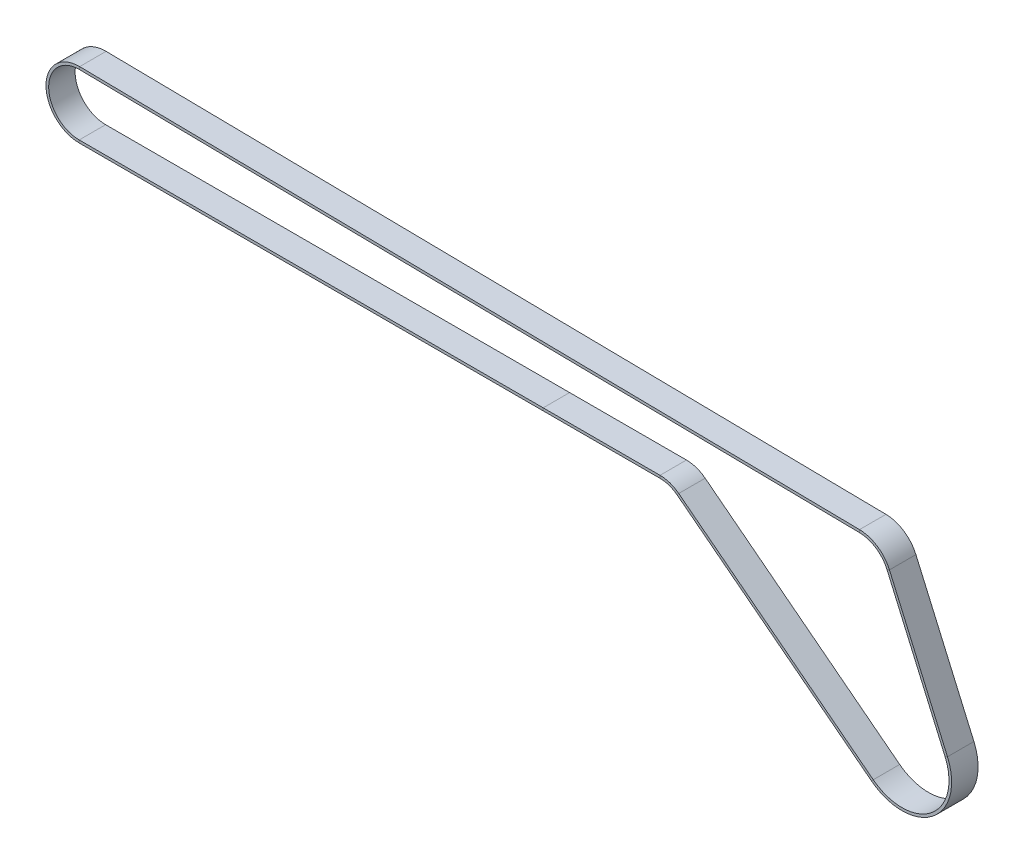
ISO-10303-21;
HEADER;
FILE_DESCRIPTION(('STEP AP214'),'2;1');
FILE_NAME('part.step','',(''),(''),'','','');
FILE_SCHEMA(('AUTOMOTIVE_DESIGN { 1 0 10303 214 1 1 1 1 }'));
ENDSEC;
DATA;
#1=APPLICATION_CONTEXT('core data for automotive mechanical design processes');
#2=APPLICATION_PROTOCOL_DEFINITION('international standard','automotive_design',2000,#1);
#3=PRODUCT_CONTEXT('',#1,'mechanical');
#4=PRODUCT('Part','Part','',(#3));
#5=PRODUCT_RELATED_PRODUCT_CATEGORY('part','',(#4));
#6=PRODUCT_DEFINITION_FORMATION('','',#4);
#7=PRODUCT_DEFINITION_CONTEXT('part definition',#1,'design');
#8=PRODUCT_DEFINITION('design','',#6,#7);
#9=PRODUCT_DEFINITION_SHAPE('','',#8);
#10=(LENGTH_UNIT() NAMED_UNIT(*) SI_UNIT(.MILLI.,.METRE.));
#11=(NAMED_UNIT(*) PLANE_ANGLE_UNIT() SI_UNIT($,.RADIAN.));
#12=(NAMED_UNIT(*) SI_UNIT($,.STERADIAN.) SOLID_ANGLE_UNIT());
#13=UNCERTAINTY_MEASURE_WITH_UNIT(LENGTH_MEASURE(1.E-05),#10,'distance_accuracy_value','');
#14=(GEOMETRIC_REPRESENTATION_CONTEXT(3) GLOBAL_UNCERTAINTY_ASSIGNED_CONTEXT((#13)) GLOBAL_UNIT_ASSIGNED_CONTEXT((#10,
#11,#12)) REPRESENTATION_CONTEXT('',''));
#15=CARTESIAN_POINT('',(0.,0.,0.));
#16=DIRECTION('',(0.,0.,1.));
#17=DIRECTION('',(1.,0.,0.));
#18=AXIS2_PLACEMENT_3D('',#15,#16,#17);
#19=CARTESIAN_POINT('',(44.1923018206319,0.,5.));
#20=DIRECTION('',(0.,0.,-1.));
#21=DIRECTION('',(-1.,0.,0.));
#22=AXIS2_PLACEMENT_3D('',#19,#20,#21);
#23=PLANE('',#22);
#24=DIRECTION('',(0.,-1.,0.));
#25=VECTOR('',#24,1.);
#26=CARTESIAN_POINT('',(44.1923018206319,0.,5.));
#27=LINE('',#26,#25);
#28=CARTESIAN_POINT('',(44.1923018206319,0.,5.));
#29=VERTEX_POINT('',#28);
#30=CARTESIAN_POINT('',(44.1923018206319,-0.999999999999999,5.));
#31=VERTEX_POINT('',#30);
#32=EDGE_CURVE('E215',#29,#31,#27,.T.);
#33=ORIENTED_EDGE('',*,*,#32,.F.);
#34=DIRECTION('',(-1.,0.,0.));
#35=VECTOR('',#34,1.);
#36=CARTESIAN_POINT('',(44.1923018206319,0.,5.));
#37=LINE('',#36,#35);
#38=CARTESIAN_POINT('',(0.,0.,5.));
#39=VERTEX_POINT('',#38);
#40=EDGE_CURVE('E214',#29,#39,#37,.T.);
#41=ORIENTED_EDGE('',*,*,#40,.T.);
#42=DIRECTION('',(0.,-1.,0.));
#43=VECTOR('',#42,1.);
#44=CARTESIAN_POINT('',(0.,0.,5.));
#45=LINE('',#44,#43);
#46=CARTESIAN_POINT('',(0.,-1.,5.));
#47=VERTEX_POINT('',#46);
#48=EDGE_CURVE('E189',#39,#47,#45,.T.);
#49=ORIENTED_EDGE('',*,*,#48,.T.);
#50=DIRECTION('',(-1.,0.,0.));
#51=VECTOR('',#50,1.);
#52=CARTESIAN_POINT('',(44.1923018206319,-0.999999999999994,5.));
#53=LINE('',#52,#51);
#54=EDGE_CURVE('E219',#31,#47,#53,.T.);
#55=ORIENTED_EDGE('',*,*,#54,.F.);
#56=EDGE_LOOP('',(#33,#41,#49,#55));
#57=FACE_BOUND('',#56,.T.);
#58=ADVANCED_FACE('F33',(#57),#23,.F.);
#59=CARTESIAN_POINT('',(0.,0.,5.));
#60=DIRECTION('',(0.,0.,-1.));
#61=DIRECTION('',(-1.,0.,0.));
#62=AXIS2_PLACEMENT_3D('',#59,#60,#61);
#63=PLANE('',#62);
#64=DIRECTION('',(-1.,0.,0.));
#65=VECTOR('',#64,1.);
#66=CARTESIAN_POINT('',(0.,-1.,5.));
#67=LINE('',#66,#65);
#68=CARTESIAN_POINT('',(-175.502777550755,-1.00000000000002,5.));
#69=VERTEX_POINT('',#68);
#70=EDGE_CURVE('E195',#47,#69,#67,.T.);
#71=ORIENTED_EDGE('',*,*,#70,.F.);
#72=ORIENTED_EDGE('',*,*,#48,.F.);
#73=DIRECTION('',(-1.,0.,0.));
#74=VECTOR('',#73,1.);
#75=CARTESIAN_POINT('',(0.,0.,5.));
#76=LINE('',#75,#74);
#77=CARTESIAN_POINT('',(-175.502777550755,0.,5.));
#78=VERTEX_POINT('',#77);
#79=EDGE_CURVE('E193',#39,#78,#76,.T.);
#80=ORIENTED_EDGE('',*,*,#79,.T.);
#81=DIRECTION('',(0.,-1.,0.));
#82=VECTOR('',#81,1.);
#83=CARTESIAN_POINT('',(-175.502777550755,0.,5.));
#84=LINE('',#83,#82);
#85=EDGE_CURVE('E211',#78,#69,#84,.T.);
#86=ORIENTED_EDGE('',*,*,#85,.T.);
#87=EDGE_LOOP('',(#71,#72,#80,#86));
#88=FACE_BOUND('',#87,.T.);
#89=ADVANCED_FACE('F191',(#88),#63,.F.);
#90=CARTESIAN_POINT('',(0.,-1.,5.));
#91=DIRECTION('',(0.,1.,0.));
#92=DIRECTION('',(0.,0.,1.));
#93=AXIS2_PLACEMENT_3D('',#90,#91,#92);
#94=PLANE('',#93);
#95=DIRECTION('',(-1.,0.,0.));
#96=VECTOR('',#95,1.);
#97=CARTESIAN_POINT('',(0.,-0.999999999999998,-5.));
#98=LINE('',#97,#96);
#99=CARTESIAN_POINT('',(0.,-0.999999999999998,-5.));
#100=VERTEX_POINT('',#99);
#101=CARTESIAN_POINT('',(-175.502777550755,-1.00000000000002,-5.));
#102=VERTEX_POINT('',#101);
#103=EDGE_CURVE('E276',#100,#102,#98,.T.);
#104=ORIENTED_EDGE('',*,*,#103,.F.);
#105=DIRECTION('',(0.,0.,-1.));
#106=VECTOR('',#105,1.);
#107=CARTESIAN_POINT('',(0.,-1.,5.));
#108=LINE('',#107,#106);
#109=EDGE_CURVE('E200',#47,#100,#108,.T.);
#110=ORIENTED_EDGE('',*,*,#109,.F.);
#111=ORIENTED_EDGE('',*,*,#70,.T.);
#112=DIRECTION('',(0.,0.,-1.));
#113=VECTOR('',#112,1.);
#114=CARTESIAN_POINT('',(-175.502777550755,-1.00000000000002,5.));
#115=LINE('',#114,#113);
#116=EDGE_CURVE('E332',#69,#102,#115,.T.);
#117=ORIENTED_EDGE('',*,*,#116,.T.);
#118=EDGE_LOOP('',(#104,#110,#111,#117));
#119=FACE_BOUND('',#118,.T.);
#120=ADVANCED_FACE('F370',(#119),#94,.F.);
#121=CARTESIAN_POINT('',(0.,0.,-5.));
#122=DIRECTION('',(0.,0.,1.));
#123=DIRECTION('',(1.,0.,0.));
#124=AXIS2_PLACEMENT_3D('',#121,#122,#123);
#125=PLANE('',#124);
#126=DIRECTION('',(-1.,0.,0.));
#127=VECTOR('',#126,1.);
#128=CARTESIAN_POINT('',(0.,0.,-5.));
#129=LINE('',#128,#127);
#130=CARTESIAN_POINT('',(0.,0.,-5.));
#131=VERTEX_POINT('',#130);
#132=CARTESIAN_POINT('',(-175.502777550755,0.,-5.));
#133=VERTEX_POINT('',#132);
#134=EDGE_CURVE('E230',#131,#133,#129,.T.);
#135=ORIENTED_EDGE('',*,*,#134,.F.);
#136=DIRECTION('',(0.,1.,0.));
#137=VECTOR('',#136,1.);
#138=CARTESIAN_POINT('',(0.,0.,-5.));
#139=LINE('',#138,#137);
#140=EDGE_CURVE('E222',#100,#131,#139,.T.);
#141=ORIENTED_EDGE('',*,*,#140,.F.);
#142=ORIENTED_EDGE('',*,*,#103,.T.);
#143=DIRECTION('',(0.,1.,0.));
#144=VECTOR('',#143,1.);
#145=CARTESIAN_POINT('',(-175.502777550755,0.,-5.));
#146=LINE('',#145,#144);
#147=EDGE_CURVE('E279',#102,#133,#146,.T.);
#148=ORIENTED_EDGE('',*,*,#147,.T.);
#149=EDGE_LOOP('',(#135,#141,#142,#148));
#150=FACE_BOUND('',#149,.T.);
#151=ADVANCED_FACE('F274',(#150),#125,.F.);
#152=CARTESIAN_POINT('',(0.,0.,5.));
#153=DIRECTION('',(0.,-1.,0.));
#154=DIRECTION('',(1.,0.,0.));
#155=AXIS2_PLACEMENT_3D('',#152,#153,#154);
#156=PLANE('',#155);
#157=DIRECTION('',(0.,0.,1.));
#158=VECTOR('',#157,1.);
#159=CARTESIAN_POINT('',(-175.502777550755,0.,5.));
#160=LINE('',#159,#158);
#161=EDGE_CURVE('E209',#133,#78,#160,.T.);
#162=ORIENTED_EDGE('',*,*,#161,.T.);
#163=ORIENTED_EDGE('',*,*,#79,.F.);
#164=DIRECTION('',(0.,0.,1.));
#165=VECTOR('',#164,1.);
#166=CARTESIAN_POINT('',(0.,0.,5.));
#167=LINE('',#166,#165);
#168=EDGE_CURVE('E207',#131,#39,#167,.T.);
#169=ORIENTED_EDGE('',*,*,#168,.F.);
#170=ORIENTED_EDGE('',*,*,#134,.T.);
#171=EDGE_LOOP('',(#162,#163,#169,#170));
#172=FACE_BOUND('',#171,.T.);
#173=ADVANCED_FACE('F205',(#172),#156,.F.);
#174=CARTESIAN_POINT('',(-175.502777550755,0.,5.));
#175=DIRECTION('',(0.,0.,-1.));
#176=DIRECTION('',(-1.,0.,0.));
#177=AXIS2_PLACEMENT_3D('',#174,#175,#176);
#178=PLANE('',#177);
#179=CARTESIAN_POINT('',(-175.502777550755,11.555,5.));
#180=DIRECTION('',(0.,0.,-1.));
#181=DIRECTION('',(0.,-1.,0.));
#182=AXIS2_PLACEMENT_3D('',#179,#180,#181);
#183=CIRCLE('',#182,12.555);
#184=CARTESIAN_POINT('',(-175.32518130957,24.1087438469612,5.));
#185=VERTEX_POINT('',#184);
#186=EDGE_CURVE('E338',#69,#185,#183,.T.);
#187=ORIENTED_EDGE('',*,*,#186,.F.);
#188=ORIENTED_EDGE('',*,*,#85,.F.);
#189=CARTESIAN_POINT('',(-175.502777550755,11.555,5.));
#190=DIRECTION('',(0.,0.,-1.));
#191=DIRECTION('',(0.,-1.,0.));
#192=AXIS2_PLACEMENT_3D('',#189,#190,#191);
#193=CIRCLE('',#192,11.555);
#194=CARTESIAN_POINT('',(-175.339326768844,23.1088438989755,5.));
#195=VERTEX_POINT('',#194);
#196=EDGE_CURVE('E229',#78,#195,#193,.T.);
#197=ORIENTED_EDGE('',*,*,#196,.T.);
#198=DIRECTION('',(0.0141454592740196,0.999899947985761,0.));
#199=VECTOR('',#198,1.);
#200=CARTESIAN_POINT('',(-175.339326768844,23.1088438989755,5.));
#201=LINE('',#200,#199);
#202=EDGE_CURVE('E388',#195,#185,#201,.T.);
#203=ORIENTED_EDGE('',*,*,#202,.T.);
#204=EDGE_LOOP('',(#187,#188,#197,#203));
#205=FACE_BOUND('',#204,.T.);
#206=ADVANCED_FACE('F458',(#205),#178,.F.);
#207=CARTESIAN_POINT('',(-175.502777550755,11.555,0.));
#208=DIRECTION('',(0.,0.,-1.));
#209=DIRECTION('',(-1.,0.,0.));
#210=AXIS2_PLACEMENT_3D('',#207,#208,#209);
#211=CYLINDRICAL_SURFACE('',#210,12.555);
#212=CARTESIAN_POINT('',(-175.502777550755,11.555,-5.));
#213=DIRECTION('',(0.,0.,-1.));
#214=DIRECTION('',(0.,-1.,0.));
#215=AXIS2_PLACEMENT_3D('',#212,#213,#214);
#216=CIRCLE('',#215,12.555);
#217=CARTESIAN_POINT('',(-175.32518130957,24.1087438469612,-5.));
#218=VERTEX_POINT('',#217);
#219=EDGE_CURVE('E287',#102,#218,#216,.T.);
#220=ORIENTED_EDGE('',*,*,#219,.F.);
#221=ORIENTED_EDGE('',*,*,#116,.F.);
#222=ORIENTED_EDGE('',*,*,#186,.T.);
#223=DIRECTION('',(0.,0.,-1.));
#224=VECTOR('',#223,1.);
#225=CARTESIAN_POINT('',(-175.32518130957,24.1087438469612,5.));
#226=LINE('',#225,#224);
#227=EDGE_CURVE('E335',#185,#218,#226,.T.);
#228=ORIENTED_EDGE('',*,*,#227,.T.);
#229=EDGE_LOOP('',(#220,#221,#222,#228));
#230=FACE_BOUND('',#229,.T.);
#231=ADVANCED_FACE('F374',(#230),#211,.T.);
#232=CARTESIAN_POINT('',(-175.502777550755,0.,-5.));
#233=DIRECTION('',(0.,0.,1.));
#234=DIRECTION('',(1.,0.,0.));
#235=AXIS2_PLACEMENT_3D('',#232,#233,#234);
#236=PLANE('',#235);
#237=CARTESIAN_POINT('',(-175.502777550755,11.555,-5.));
#238=DIRECTION('',(0.,0.,-1.));
#239=DIRECTION('',(0.,-1.,0.));
#240=AXIS2_PLACEMENT_3D('',#237,#238,#239);
#241=CIRCLE('',#240,11.555);
#242=CARTESIAN_POINT('',(-175.339326768844,23.1088438989755,-5.));
#243=VERTEX_POINT('',#242);
#244=EDGE_CURVE('E235',#133,#243,#241,.T.);
#245=ORIENTED_EDGE('',*,*,#244,.F.);
#246=ORIENTED_EDGE('',*,*,#147,.F.);
#247=ORIENTED_EDGE('',*,*,#219,.T.);
#248=DIRECTION('',(-0.0141454592740196,-0.999899947985761,0.));
#249=VECTOR('',#248,1.);
#250=CARTESIAN_POINT('',(-175.339326768844,23.1088438989755,-5.));
#251=LINE('',#250,#249);
#252=EDGE_CURVE('E284',#218,#243,#251,.T.);
#253=ORIENTED_EDGE('',*,*,#252,.T.);
#254=EDGE_LOOP('',(#245,#246,#247,#253));
#255=FACE_BOUND('',#254,.T.);
#256=ADVANCED_FACE('F378',(#255),#236,.F.);
#257=CARTESIAN_POINT('',(-175.502777550755,11.555,0.));
#258=DIRECTION('',(0.,0.,-1.));
#259=DIRECTION('',(-1.,0.,0.));
#260=AXIS2_PLACEMENT_3D('',#257,#258,#259);
#261=CYLINDRICAL_SURFACE('',#260,11.555);
#262=DIRECTION('',(0.,0.,1.));
#263=VECTOR('',#262,1.);
#264=CARTESIAN_POINT('',(-175.339326768844,23.1088438989755,5.));
#265=LINE('',#264,#263);
#266=EDGE_CURVE('E231',#243,#195,#265,.T.);
#267=ORIENTED_EDGE('',*,*,#266,.T.);
#268=ORIENTED_EDGE('',*,*,#196,.F.);
#269=ORIENTED_EDGE('',*,*,#161,.F.);
#270=ORIENTED_EDGE('',*,*,#244,.T.);
#271=EDGE_LOOP('',(#267,#268,#269,#270));
#272=FACE_BOUND('',#271,.T.);
#273=ADVANCED_FACE('F382',(#272),#261,.F.);
#274=CARTESIAN_POINT('',(-175.339326768844,23.1088438989755,5.));
#275=DIRECTION('',(0.,0.,-1.));
#276=DIRECTION('',(-1.,0.,0.));
#277=AXIS2_PLACEMENT_3D('',#274,#275,#276);
#278=PLANE('',#277);
#279=DIRECTION('',(0.999899947985761,-0.014145459274014,0.));
#280=VECTOR('',#279,1.);
#281=CARTESIAN_POINT('',(-175.32518130957,24.1087438469612,5.));
#282=LINE('',#281,#280);
#283=CARTESIAN_POINT('',(119.64530334623,19.9358333611271,5.));
#284=VERTEX_POINT('',#283);
#285=EDGE_CURVE('E343',#185,#284,#282,.T.);
#286=ORIENTED_EDGE('',*,*,#285,.F.);
#287=ORIENTED_EDGE('',*,*,#202,.F.);
#288=DIRECTION('',(0.999899947985761,-0.014145459274014,0.));
#289=VECTOR('',#288,1.);
#290=CARTESIAN_POINT('',(-175.339326768844,23.1088438989755,5.));
#291=LINE('',#290,#289);
#292=CARTESIAN_POINT('',(119.631157886956,18.9359334131414,5.));
#293=VERTEX_POINT('',#292);
#294=EDGE_CURVE('E234',#195,#293,#291,.T.);
#295=ORIENTED_EDGE('',*,*,#294,.T.);
#296=DIRECTION('',(0.0141454592740141,0.999899947985761,0.));
#297=VECTOR('',#296,1.);
#298=CARTESIAN_POINT('',(119.631157886956,18.9359334131414,5.));
#299=LINE('',#298,#297);
#300=EDGE_CURVE('E294',#293,#284,#299,.T.);
#301=ORIENTED_EDGE('',*,*,#300,.T.);
#302=EDGE_LOOP('',(#286,#287,#295,#301));
#303=FACE_BOUND('',#302,.T.);
#304=ADVANCED_FACE('F456',(#303),#278,.F.);
#305=CARTESIAN_POINT('',(-175.32518130957,24.1087438469612,5.));
#306=DIRECTION('',(-0.014145459274014,-0.999899947985761,0.));
#307=DIRECTION('',(0.999899947985761,-0.014145459274014,0.));
#308=AXIS2_PLACEMENT_3D('',#305,#306,#307);
#309=PLANE('',#308);
#310=DIRECTION('',(0.999899947985761,-0.014145459274014,0.));
#311=VECTOR('',#310,1.);
#312=CARTESIAN_POINT('',(-175.32518130957,24.1087438469612,-5.));
#313=LINE('',#312,#311);
#314=CARTESIAN_POINT('',(119.64530334623,19.9358333611271,-5.));
#315=VERTEX_POINT('',#314);
#316=EDGE_CURVE('E295',#218,#315,#313,.T.);
#317=ORIENTED_EDGE('',*,*,#316,.F.);
#318=ORIENTED_EDGE('',*,*,#227,.F.);
#319=ORIENTED_EDGE('',*,*,#285,.T.);
#320=DIRECTION('',(0.,0.,-1.));
#321=VECTOR('',#320,1.);
#322=CARTESIAN_POINT('',(119.64530334623,19.9358333611271,5.));
#323=LINE('',#322,#321);
#324=EDGE_CURVE('E291',#284,#315,#323,.T.);
#325=ORIENTED_EDGE('',*,*,#324,.T.);
#326=EDGE_LOOP('',(#317,#318,#319,#325));
#327=FACE_BOUND('',#326,.T.);
#328=ADVANCED_FACE('F455',(#327),#309,.F.);
#329=CARTESIAN_POINT('',(-175.339326768844,23.1088438989755,-5.));
#330=DIRECTION('',(0.,0.,1.));
#331=DIRECTION('',(1.,0.,0.));
#332=AXIS2_PLACEMENT_3D('',#329,#330,#331);
#333=PLANE('',#332);
#334=DIRECTION('',(0.999899947985761,-0.014145459274014,0.));
#335=VECTOR('',#334,1.);
#336=CARTESIAN_POINT('',(-175.339326768844,23.1088438989755,-5.));
#337=LINE('',#336,#335);
#338=CARTESIAN_POINT('',(119.631157886956,18.9359334131414,-5.));
#339=VERTEX_POINT('',#338);
#340=EDGE_CURVE('E292',#243,#339,#337,.T.);
#341=ORIENTED_EDGE('',*,*,#340,.F.);
#342=ORIENTED_EDGE('',*,*,#252,.F.);
#343=ORIENTED_EDGE('',*,*,#316,.T.);
#344=DIRECTION('',(-0.0141454592740141,-0.999899947985761,0.));
#345=VECTOR('',#344,1.);
#346=CARTESIAN_POINT('',(119.631157886956,18.9359334131414,-5.));
#347=LINE('',#346,#345);
#348=EDGE_CURVE('E240',#315,#339,#347,.T.);
#349=ORIENTED_EDGE('',*,*,#348,.T.);
#350=EDGE_LOOP('',(#341,#342,#343,#349));
#351=FACE_BOUND('',#350,.T.);
#352=ADVANCED_FACE('F453',(#351),#333,.F.);
#353=CARTESIAN_POINT('',(-175.339326768844,23.1088438989755,5.));
#354=DIRECTION('',(0.014145459274014,0.999899947985761,0.));
#355=DIRECTION('',(-0.999899947985761,0.014145459274014,0.));
#356=AXIS2_PLACEMENT_3D('',#353,#354,#355);
#357=PLANE('',#356);
#358=DIRECTION('',(0.,0.,1.));
#359=VECTOR('',#358,1.);
#360=CARTESIAN_POINT('',(119.631157886956,18.9359334131414,5.));
#361=LINE('',#360,#359);
#362=EDGE_CURVE('E236',#339,#293,#361,.T.);
#363=ORIENTED_EDGE('',*,*,#362,.T.);
#364=ORIENTED_EDGE('',*,*,#294,.F.);
#365=ORIENTED_EDGE('',*,*,#266,.F.);
#366=ORIENTED_EDGE('',*,*,#340,.T.);
#367=EDGE_LOOP('',(#363,#364,#365,#366));
#368=FACE_BOUND('',#367,.T.);
#369=ADVANCED_FACE('F451',(#368),#357,.F.);
#370=CARTESIAN_POINT('',(119.631157886956,18.9359334131414,5.));
#371=DIRECTION('',(0.,0.,-1.));
#372=DIRECTION('',(-1.,0.,0.));
#373=AXIS2_PLACEMENT_3D('',#370,#371,#372);
#374=PLANE('',#373);
#375=CARTESIAN_POINT('',(119.467707105045,7.38208951416586,5.));
#376=DIRECTION('',(0.,0.,-1.));
#377=DIRECTION('',(0.0141454592740025,0.999899947985761,0.));
#378=AXIS2_PLACEMENT_3D('',#375,#376,#377);
#379=CIRCLE('',#378,12.555);
#380=CARTESIAN_POINT('',(130.973228782012,12.4071264235667,5.));
#381=VERTEX_POINT('',#380);
#382=EDGE_CURVE('E347',#284,#381,#379,.T.);
#383=ORIENTED_EDGE('',*,*,#382,.F.);
#384=ORIENTED_EDGE('',*,*,#300,.F.);
#385=CARTESIAN_POINT('',(119.467707105045,7.38208951416586,5.));
#386=DIRECTION('',(0.,0.,-1.));
#387=DIRECTION('',(0.0141454592740014,0.999899947985761,0.));
#388=AXIS2_PLACEMENT_3D('',#385,#386,#387);
#389=CIRCLE('',#388,11.555);
#390=CARTESIAN_POINT('',(130.056819249796,12.0068845351238,5.));
#391=VERTEX_POINT('',#390);
#392=EDGE_CURVE('E239',#293,#391,#389,.T.);
#393=ORIENTED_EDGE('',*,*,#392,.T.);
#394=DIRECTION('',(0.916409532215622,0.400241888442906,0.));
#395=VECTOR('',#394,1.);
#396=CARTESIAN_POINT('',(130.056819249796,12.0068845351238,5.));
#397=LINE('',#396,#395);
#398=EDGE_CURVE('E397',#391,#381,#397,.T.);
#399=ORIENTED_EDGE('',*,*,#398,.T.);
#400=EDGE_LOOP('',(#383,#384,#393,#399));
#401=FACE_BOUND('',#400,.T.);
#402=ADVANCED_FACE('F447',(#401),#374,.F.);
#403=CARTESIAN_POINT('',(119.467707105045,7.38208951416586,0.));
#404=DIRECTION('',(0.,0.,-1.));
#405=DIRECTION('',(-1.,0.,0.));
#406=AXIS2_PLACEMENT_3D('',#403,#404,#405);
#407=CYLINDRICAL_SURFACE('',#406,12.555);
#408=CARTESIAN_POINT('',(119.467707105045,7.38208951416586,-5.));
#409=DIRECTION('',(0.,0.,-1.));
#410=DIRECTION('',(0.0141454592740025,0.999899947985761,0.));
#411=AXIS2_PLACEMENT_3D('',#408,#409,#410);
#412=CIRCLE('',#411,12.555);
#413=CARTESIAN_POINT('',(130.973228782012,12.4071264235667,-5.));
#414=VERTEX_POINT('',#413);
#415=EDGE_CURVE('E299',#315,#414,#412,.T.);
#416=ORIENTED_EDGE('',*,*,#415,.F.);
#417=ORIENTED_EDGE('',*,*,#324,.F.);
#418=ORIENTED_EDGE('',*,*,#382,.T.);
#419=DIRECTION('',(0.,0.,-1.));
#420=VECTOR('',#419,1.);
#421=CARTESIAN_POINT('',(130.973228782012,12.4071264235667,5.));
#422=LINE('',#421,#420);
#423=EDGE_CURVE('E344',#381,#414,#422,.T.);
#424=ORIENTED_EDGE('',*,*,#423,.T.);
#425=EDGE_LOOP('',(#416,#417,#418,#424));
#426=FACE_BOUND('',#425,.T.);
#427=ADVANCED_FACE('F443',(#426),#407,.T.);
#428=CARTESIAN_POINT('',(119.631157886956,18.9359334131414,-5.));
#429=DIRECTION('',(0.,0.,1.));
#430=DIRECTION('',(1.,0.,0.));
#431=AXIS2_PLACEMENT_3D('',#428,#429,#430);
#432=PLANE('',#431);
#433=CARTESIAN_POINT('',(119.467707105045,7.38208951416586,-5.));
#434=DIRECTION('',(0.,0.,-1.));
#435=DIRECTION('',(0.0141454592740014,0.999899947985761,0.));
#436=AXIS2_PLACEMENT_3D('',#433,#434,#435);
#437=CIRCLE('',#436,11.555);
#438=CARTESIAN_POINT('',(130.056819249796,12.0068845351238,-5.));
#439=VERTEX_POINT('',#438);
#440=EDGE_CURVE('E245',#339,#439,#437,.T.);
#441=ORIENTED_EDGE('',*,*,#440,.F.);
#442=ORIENTED_EDGE('',*,*,#348,.F.);
#443=ORIENTED_EDGE('',*,*,#415,.T.);
#444=DIRECTION('',(-0.916409532215622,-0.400241888442906,0.));
#445=VECTOR('',#444,1.);
#446=CARTESIAN_POINT('',(130.056819249796,12.0068845351238,-5.));
#447=LINE('',#446,#445);
#448=EDGE_CURVE('E296',#414,#439,#447,.T.);
#449=ORIENTED_EDGE('',*,*,#448,.T.);
#450=EDGE_LOOP('',(#441,#442,#443,#449));
#451=FACE_BOUND('',#450,.T.);
#452=ADVANCED_FACE('F439',(#451),#432,.F.);
#453=CARTESIAN_POINT('',(119.467707105045,7.38208951416586,0.));
#454=DIRECTION('',(0.,0.,-1.));
#455=DIRECTION('',(-1.,0.,0.));
#456=AXIS2_PLACEMENT_3D('',#453,#454,#455);
#457=CYLINDRICAL_SURFACE('',#456,11.555);
#458=DIRECTION('',(0.,0.,1.));
#459=VECTOR('',#458,1.);
#460=CARTESIAN_POINT('',(130.056819249796,12.0068845351238,5.));
#461=LINE('',#460,#459);
#462=EDGE_CURVE('E241',#439,#391,#461,.T.);
#463=ORIENTED_EDGE('',*,*,#462,.T.);
#464=ORIENTED_EDGE('',*,*,#392,.F.);
#465=ORIENTED_EDGE('',*,*,#362,.F.);
#466=ORIENTED_EDGE('',*,*,#440,.T.);
#467=EDGE_LOOP('',(#463,#464,#465,#466));
#468=FACE_BOUND('',#467,.T.);
#469=ADVANCED_FACE('F434',(#468),#457,.F.);
#470=CARTESIAN_POINT('',(130.056819249796,12.0068845351238,5.));
#471=DIRECTION('',(0.,0.,-1.));
#472=DIRECTION('',(-1.,0.,0.));
#473=AXIS2_PLACEMENT_3D('',#470,#471,#472);
#474=PLANE('',#473);
#475=DIRECTION('',(0.400241888442905,-0.916409532215623,0.));
#476=VECTOR('',#475,1.);
#477=CARTESIAN_POINT('',(130.973228782012,12.4071264235667,5.));
#478=LINE('',#477,#476);
#479=CARTESIAN_POINT('',(152.919794480943,-37.8425915260987,5.));
#480=VERTEX_POINT('',#479);
#481=EDGE_CURVE('E352',#381,#480,#478,.T.);
#482=ORIENTED_EDGE('',*,*,#481,.F.);
#483=ORIENTED_EDGE('',*,*,#398,.F.);
#484=DIRECTION('',(0.400241888442905,-0.916409532215623,0.));
#485=VECTOR('',#484,1.);
#486=CARTESIAN_POINT('',(130.056819249796,12.0068845351238,5.));
#487=LINE('',#486,#485);
#488=CARTESIAN_POINT('',(152.003384948728,-38.2428334145416,5.));
#489=VERTEX_POINT('',#488);
#490=EDGE_CURVE('E244',#391,#489,#487,.T.);
#491=ORIENTED_EDGE('',*,*,#490,.T.);
#492=DIRECTION('',(0.916409532215623,0.400241888442905,0.));
#493=VECTOR('',#492,1.);
#494=CARTESIAN_POINT('',(152.003384948728,-38.2428334145416,5.));
#495=LINE('',#494,#493);
#496=EDGE_CURVE('E402',#489,#480,#495,.T.);
#497=ORIENTED_EDGE('',*,*,#496,.T.);
#498=EDGE_LOOP('',(#482,#483,#491,#497));
#499=FACE_BOUND('',#498,.T.);
#500=ADVANCED_FACE('F428',(#499),#474,.F.);
#501=CARTESIAN_POINT('',(130.973228782012,12.4071264235667,5.));
#502=DIRECTION('',(-0.916409532215623,-0.400241888442905,0.));
#503=DIRECTION('',(0.400241888442905,-0.916409532215623,0.));
#504=AXIS2_PLACEMENT_3D('',#501,#502,#503);
#505=PLANE('',#504);
#506=DIRECTION('',(0.400241888442905,-0.916409532215623,0.));
#507=VECTOR('',#506,1.);
#508=CARTESIAN_POINT('',(130.973228782012,12.4071264235667,-5.));
#509=LINE('',#508,#507);
#510=CARTESIAN_POINT('',(152.919794480943,-37.8425915260987,-5.));
#511=VERTEX_POINT('',#510);
#512=EDGE_CURVE('E304',#414,#511,#509,.T.);
#513=ORIENTED_EDGE('',*,*,#512,.F.);
#514=ORIENTED_EDGE('',*,*,#423,.F.);
#515=ORIENTED_EDGE('',*,*,#481,.T.);
#516=DIRECTION('',(0.,0.,-1.));
#517=VECTOR('',#516,1.);
#518=CARTESIAN_POINT('',(152.919794480943,-37.8425915260987,5.));
#519=LINE('',#518,#517);
#520=EDGE_CURVE('E349',#480,#511,#519,.T.);
#521=ORIENTED_EDGE('',*,*,#520,.T.);
#522=EDGE_LOOP('',(#513,#514,#515,#521));
#523=FACE_BOUND('',#522,.T.);
#524=ADVANCED_FACE('F424',(#523),#505,.F.);
#525=CARTESIAN_POINT('',(130.056819249796,12.0068845351238,-5.));
#526=DIRECTION('',(0.,0.,1.));
#527=DIRECTION('',(1.,0.,0.));
#528=AXIS2_PLACEMENT_3D('',#525,#526,#527);
#529=PLANE('',#528);
#530=DIRECTION('',(0.400241888442905,-0.916409532215623,0.));
#531=VECTOR('',#530,1.);
#532=CARTESIAN_POINT('',(130.056819249796,12.0068845351238,-5.));
#533=LINE('',#532,#531);
#534=CARTESIAN_POINT('',(152.003384948728,-38.2428334145416,-5.));
#535=VERTEX_POINT('',#534);
#536=EDGE_CURVE('E250',#439,#535,#533,.T.);
#537=ORIENTED_EDGE('',*,*,#536,.F.);
#538=ORIENTED_EDGE('',*,*,#448,.F.);
#539=ORIENTED_EDGE('',*,*,#512,.T.);
#540=DIRECTION('',(-0.916409532215623,-0.400241888442905,0.));
#541=VECTOR('',#540,1.);
#542=CARTESIAN_POINT('',(152.003384948728,-38.2428334145416,-5.));
#543=LINE('',#542,#541);
#544=EDGE_CURVE('E301',#511,#535,#543,.T.);
#545=ORIENTED_EDGE('',*,*,#544,.T.);
#546=EDGE_LOOP('',(#537,#538,#539,#545));
#547=FACE_BOUND('',#546,.T.);
#548=ADVANCED_FACE('F418',(#547),#529,.F.);
#549=CARTESIAN_POINT('',(130.056819249796,12.0068845351238,5.));
#550=DIRECTION('',(0.916409532215623,0.400241888442905,0.));
#551=DIRECTION('',(-0.400241888442905,0.916409532215623,0.));
#552=AXIS2_PLACEMENT_3D('',#549,#550,#551);
#553=PLANE('',#552);
#554=DIRECTION('',(0.,0.,1.));
#555=VECTOR('',#554,1.);
#556=CARTESIAN_POINT('',(152.003384948728,-38.2428334145416,5.));
#557=LINE('',#556,#555);
#558=EDGE_CURVE('E246',#535,#489,#557,.T.);
#559=ORIENTED_EDGE('',*,*,#558,.T.);
#560=ORIENTED_EDGE('',*,*,#490,.F.);
#561=ORIENTED_EDGE('',*,*,#462,.F.);
#562=ORIENTED_EDGE('',*,*,#536,.T.);
#563=EDGE_LOOP('',(#559,#560,#561,#562));
#564=FACE_BOUND('',#563,.T.);
#565=ADVANCED_FACE('F431',(#564),#553,.F.);
#566=CARTESIAN_POINT('',(152.003384948728,-38.2428334145416,5.));
#567=DIRECTION('',(0.,0.,-1.));
#568=DIRECTION('',(-1.,0.,0.));
#569=AXIS2_PLACEMENT_3D('',#566,#567,#568);
#570=PLANE('',#569);
#571=CARTESIAN_POINT('',(135.723369608918,-45.3531305627309,5.));
#572=DIRECTION('',(0.,0.,-1.));
#573=DIRECTION('',(0.916409532215598,0.400241888442963,0.));
#574=AXIS2_PLACEMENT_3D('',#571,#572,#573);
#575=CIRCLE('',#574,18.765);
#576=CARTESIAN_POINT('',(124.234007821181,-60.1895651314034,5.));
#577=VERTEX_POINT('',#576);
#578=EDGE_CURVE('E158',#480,#577,#575,.T.);
#579=ORIENTED_EDGE('',*,*,#578,.F.);
#580=ORIENTED_EDGE('',*,*,#496,.F.);
#581=CARTESIAN_POINT('',(135.723369608918,-45.3531305627309,5.));
#582=DIRECTION('',(0.,0.,-1.));
#583=DIRECTION('',(0.916409532215598,0.400241888442964,0.));
#584=AXIS2_PLACEMENT_3D('',#581,#582,#583);
#585=CIRCLE('',#584,17.765);
#586=CARTESIAN_POINT('',(124.846283962281,-59.3989211362703,5.));
#587=VERTEX_POINT('',#586);
#588=EDGE_CURVE('E249',#489,#587,#585,.T.);
#589=ORIENTED_EDGE('',*,*,#588,.T.);
#590=DIRECTION('',(-0.612276141099739,-0.790643995133089,0.));
#591=VECTOR('',#590,1.);
#592=CARTESIAN_POINT('',(124.846283962281,-59.3989211362703,5.));
#593=LINE('',#592,#591);
#594=EDGE_CURVE('E407',#587,#577,#593,.T.);
#595=ORIENTED_EDGE('',*,*,#594,.T.);
#596=EDGE_LOOP('',(#579,#580,#589,#595));
#597=FACE_BOUND('',#596,.T.);
#598=ADVANCED_FACE('F412',(#597),#570,.F.);
#599=CARTESIAN_POINT('',(135.723369608918,-45.3531305627309,0.));
#600=DIRECTION('',(0.,0.,-1.));
#601=DIRECTION('',(-1.,0.,0.));
#602=AXIS2_PLACEMENT_3D('',#599,#600,#601);
#603=CYLINDRICAL_SURFACE('',#602,18.765);
#604=CARTESIAN_POINT('',(135.723369608918,-45.3531305627309,-5.));
#605=DIRECTION('',(0.,0.,-1.));
#606=DIRECTION('',(0.916409532215598,0.400241888442963,0.));
#607=AXIS2_PLACEMENT_3D('',#604,#605,#606);
#608=CIRCLE('',#607,18.765);
#609=CARTESIAN_POINT('',(124.234007821181,-60.1895651314034,-5.));
#610=VERTEX_POINT('',#609);
#611=EDGE_CURVE('E152',#511,#610,#608,.T.);
#612=ORIENTED_EDGE('',*,*,#611,.F.);
#613=ORIENTED_EDGE('',*,*,#520,.F.);
#614=ORIENTED_EDGE('',*,*,#578,.T.);
#615=DIRECTION('',(0.,0.,-1.));
#616=VECTOR('',#615,1.);
#617=CARTESIAN_POINT('',(124.234007821181,-60.1895651314034,5.));
#618=LINE('',#617,#616);
#619=EDGE_CURVE('E354',#577,#610,#618,.T.);
#620=ORIENTED_EDGE('',*,*,#619,.T.);
#621=EDGE_LOOP('',(#612,#613,#614,#620));
#622=FACE_BOUND('',#621,.T.);
#623=ADVANCED_FACE('F415',(#622),#603,.T.);
#624=CARTESIAN_POINT('',(152.003384948728,-38.2428334145416,-5.));
#625=DIRECTION('',(0.,0.,1.));
#626=DIRECTION('',(1.,0.,0.));
#627=AXIS2_PLACEMENT_3D('',#624,#625,#626);
#628=PLANE('',#627);
#629=CARTESIAN_POINT('',(135.723369608918,-45.3531305627309,-5.));
#630=DIRECTION('',(0.,0.,-1.));
#631=DIRECTION('',(0.916409532215598,0.400241888442964,0.));
#632=AXIS2_PLACEMENT_3D('',#629,#630,#631);
#633=CIRCLE('',#632,17.765);
#634=CARTESIAN_POINT('',(124.846283962281,-59.3989211362703,-5.));
#635=VERTEX_POINT('',#634);
#636=EDGE_CURVE('E254',#535,#635,#633,.T.);
#637=ORIENTED_EDGE('',*,*,#636,.F.);
#638=ORIENTED_EDGE('',*,*,#544,.F.);
#639=ORIENTED_EDGE('',*,*,#611,.T.);
#640=DIRECTION('',(0.612276141099739,0.790643995133089,0.));
#641=VECTOR('',#640,1.);
#642=CARTESIAN_POINT('',(124.846283962281,-59.3989211362703,-5.));
#643=LINE('',#642,#641);
#644=EDGE_CURVE('E306',#610,#635,#643,.T.);
#645=ORIENTED_EDGE('',*,*,#644,.T.);
#646=EDGE_LOOP('',(#637,#638,#639,#645));
#647=FACE_BOUND('',#646,.T.);
#648=ADVANCED_FACE('F312',(#647),#628,.F.);
#649=CARTESIAN_POINT('',(135.723369608918,-45.3531305627309,0.));
#650=DIRECTION('',(0.,0.,-1.));
#651=DIRECTION('',(-1.,0.,0.));
#652=AXIS2_PLACEMENT_3D('',#649,#650,#651);
#653=CYLINDRICAL_SURFACE('',#652,17.765);
#654=DIRECTION('',(0.,0.,1.));
#655=VECTOR('',#654,1.);
#656=CARTESIAN_POINT('',(124.846283962281,-59.3989211362703,5.));
#657=LINE('',#656,#655);
#658=EDGE_CURVE('E251',#635,#587,#657,.T.);
#659=ORIENTED_EDGE('',*,*,#658,.T.);
#660=ORIENTED_EDGE('',*,*,#588,.F.);
#661=ORIENTED_EDGE('',*,*,#558,.F.);
#662=ORIENTED_EDGE('',*,*,#636,.T.);
#663=EDGE_LOOP('',(#659,#660,#661,#662));
#664=FACE_BOUND('',#663,.T.);
#665=ADVANCED_FACE('F310',(#664),#653,.F.);
#666=CARTESIAN_POINT('',(124.846283962281,-59.3989211362703,5.));
#667=DIRECTION('',(0.,0.,-1.));
#668=DIRECTION('',(-1.,0.,0.));
#669=AXIS2_PLACEMENT_3D('',#666,#667,#668);
#670=PLANE('',#669);
#671=DIRECTION('',(-0.790643995133108,0.612276141099714,0.));
#672=VECTOR('',#671,1.);
#673=CARTESIAN_POINT('',(124.234007821181,-60.1895651314034,5.));
#674=LINE('',#673,#672);
#675=CARTESIAN_POINT('',(50.6548764899394,-3.20975263137011,5.));
#676=VERTEX_POINT('',#675);
#677=EDGE_CURVE('E123',#577,#676,#674,.T.);
#678=ORIENTED_EDGE('',*,*,#677,.F.);
#679=ORIENTED_EDGE('',*,*,#594,.F.);
#680=DIRECTION('',(-0.790643995133108,0.612276141099714,0.));
#681=VECTOR('',#680,1.);
#682=CARTESIAN_POINT('',(124.846283962281,-59.3989211362703,5.));
#683=LINE('',#682,#681);
#684=CARTESIAN_POINT('',(51.2671526310391,-2.41910863623702,5.));
#685=VERTEX_POINT('',#684);
#686=EDGE_CURVE('E253',#587,#685,#683,.T.);
#687=ORIENTED_EDGE('',*,*,#686,.T.);
#688=DIRECTION('',(-0.612276141099714,-0.790643995133108,0.));
#689=VECTOR('',#688,1.);
#690=CARTESIAN_POINT('',(51.2671526310391,-2.41910863623703,5.));
#691=LINE('',#690,#689);
#692=EDGE_CURVE('E318',#685,#676,#691,.T.);
#693=ORIENTED_EDGE('',*,*,#692,.T.);
#694=EDGE_LOOP('',(#678,#679,#687,#693));
#695=FACE_BOUND('',#694,.T.);
#696=ADVANCED_FACE('F413',(#695),#670,.F.);
#697=CARTESIAN_POINT('',(124.234007821181,-60.1895651314034,5.));
#698=DIRECTION('',(0.612276141099714,0.790643995133108,0.));
#699=DIRECTION('',(-0.790643995133108,0.612276141099714,0.));
#700=AXIS2_PLACEMENT_3D('',#697,#698,#699);
#701=PLANE('',#700);
#702=DIRECTION('',(-0.790643995133108,0.612276141099714,0.));
#703=VECTOR('',#702,1.);
#704=CARTESIAN_POINT('',(124.234007821181,-60.1895651314034,-5.));
#705=LINE('',#704,#703);
#706=CARTESIAN_POINT('',(50.6548764899394,-3.20975263137013,-5.));
#707=VERTEX_POINT('',#706);
#708=EDGE_CURVE('E116',#610,#707,#705,.T.);
#709=ORIENTED_EDGE('',*,*,#708,.F.);
#710=ORIENTED_EDGE('',*,*,#619,.F.);
#711=ORIENTED_EDGE('',*,*,#677,.T.);
#712=DIRECTION('',(0.,0.,-1.));
#713=VECTOR('',#712,1.);
#714=CARTESIAN_POINT('',(50.6548764899394,-3.20975263137013,5.));
#715=LINE('',#714,#713);
#716=EDGE_CURVE('E357',#676,#707,#715,.T.);
#717=ORIENTED_EDGE('',*,*,#716,.T.);
#718=EDGE_LOOP('',(#709,#710,#711,#717));
#719=FACE_BOUND('',#718,.T.);
#720=ADVANCED_FACE('F414',(#719),#701,.F.);
#721=CARTESIAN_POINT('',(124.846283962281,-59.3989211362703,-5.));
#722=DIRECTION('',(0.,0.,1.));
#723=DIRECTION('',(1.,0.,0.));
#724=AXIS2_PLACEMENT_3D('',#721,#722,#723);
#725=PLANE('',#724);
#726=DIRECTION('',(-0.790643995133108,0.612276141099714,0.));
#727=VECTOR('',#726,1.);
#728=CARTESIAN_POINT('',(124.846283962281,-59.3989211362703,-5.));
#729=LINE('',#728,#727);
#730=CARTESIAN_POINT('',(51.2671526310391,-2.41910863623702,-5.));
#731=VERTEX_POINT('',#730);
#732=EDGE_CURVE('E107',#635,#731,#729,.T.);
#733=ORIENTED_EDGE('',*,*,#732,.F.);
#734=ORIENTED_EDGE('',*,*,#644,.F.);
#735=ORIENTED_EDGE('',*,*,#708,.T.);
#736=DIRECTION('',(0.612276141099714,0.790643995133108,0.));
#737=VECTOR('',#736,1.);
#738=CARTESIAN_POINT('',(51.2671526310391,-2.41910863623703,-5.));
#739=LINE('',#738,#737);
#740=EDGE_CURVE('E260',#707,#731,#739,.T.);
#741=ORIENTED_EDGE('',*,*,#740,.T.);
#742=EDGE_LOOP('',(#733,#734,#735,#741));
#743=FACE_BOUND('',#742,.T.);
#744=ADVANCED_FACE('F313',(#743),#725,.F.);
#745=CARTESIAN_POINT('',(124.846283962281,-59.3989211362703,5.));
#746=DIRECTION('',(-0.612276141099714,-0.790643995133108,0.));
#747=DIRECTION('',(0.790643995133108,-0.612276141099714,0.));
#748=AXIS2_PLACEMENT_3D('',#745,#746,#747);
#749=PLANE('',#748);
#750=DIRECTION('',(0.,0.,1.));
#751=VECTOR('',#750,1.);
#752=CARTESIAN_POINT('',(51.2671526310391,-2.41910863623703,5.));
#753=LINE('',#752,#751);
#754=EDGE_CURVE('E255',#731,#685,#753,.T.);
#755=ORIENTED_EDGE('',*,*,#754,.T.);
#756=ORIENTED_EDGE('',*,*,#686,.F.);
#757=ORIENTED_EDGE('',*,*,#658,.F.);
#758=ORIENTED_EDGE('',*,*,#732,.T.);
#759=EDGE_LOOP('',(#755,#756,#757,#758));
#760=FACE_BOUND('',#759,.T.);
#761=ADVANCED_FACE('F314',(#760),#749,.F.);
#762=CARTESIAN_POINT('',(51.2671526310391,-2.41910863623703,5.));
#763=DIRECTION('',(0.,0.,-1.));
#764=DIRECTION('',(-1.,0.,0.));
#765=AXIS2_PLACEMENT_3D('',#762,#763,#764);
#766=PLANE('',#765);
#767=CARTESIAN_POINT('',(44.1923018206318,-11.555,5.));
#768=DIRECTION('',(0.,0.,1.));
#769=DIRECTION('',(0.612276141099727,0.790643995133099,0.));
#770=AXIS2_PLACEMENT_3D('',#767,#768,#769);
#771=CIRCLE('',#770,10.555);
#772=EDGE_CURVE('E324',#676,#31,#771,.T.);
#773=ORIENTED_EDGE('',*,*,#772,.F.);
#774=ORIENTED_EDGE('',*,*,#692,.F.);
#775=CARTESIAN_POINT('',(44.1923018206318,-11.555,5.));
#776=DIRECTION('',(0.,0.,1.));
#777=DIRECTION('',(0.612276141099726,0.7906439951331,0.));
#778=AXIS2_PLACEMENT_3D('',#775,#776,#777);
#779=CIRCLE('',#778,11.555);
#780=EDGE_CURVE('E256',#685,#29,#779,.T.);
#781=ORIENTED_EDGE('',*,*,#780,.T.);
#782=ORIENTED_EDGE('',*,*,#32,.T.);
#783=EDGE_LOOP('',(#773,#774,#781,#782));
#784=FACE_BOUND('',#783,.T.);
#785=ADVANCED_FACE('F478',(#784),#766,.F.);
#786=CARTESIAN_POINT('',(44.1923018206318,-11.555,0.));
#787=DIRECTION('',(0.,0.,1.));
#788=DIRECTION('',(1.,0.,0.));
#789=AXIS2_PLACEMENT_3D('',#786,#787,#788);
#790=CYLINDRICAL_SURFACE('',#789,10.555);
#791=CARTESIAN_POINT('',(44.1923018206318,-11.555,-5.));
#792=DIRECTION('',(0.,0.,1.));
#793=DIRECTION('',(0.612276141099727,0.790643995133099,0.));
#794=AXIS2_PLACEMENT_3D('',#791,#792,#793);
#795=CIRCLE('',#794,10.555);
#796=CARTESIAN_POINT('',(44.1923018206319,-0.999999999999994,-5.));
#797=VERTEX_POINT('',#796);
#798=EDGE_CURVE('E58',#707,#797,#795,.T.);
#799=ORIENTED_EDGE('',*,*,#798,.F.);
#800=ORIENTED_EDGE('',*,*,#716,.F.);
#801=ORIENTED_EDGE('',*,*,#772,.T.);
#802=DIRECTION('',(0.,0.,-1.));
#803=VECTOR('',#802,1.);
#804=CARTESIAN_POINT('',(44.1923018206319,-0.999999999999998,5.));
#805=LINE('',#804,#803);
#806=EDGE_CURVE('E326',#31,#797,#805,.T.);
#807=ORIENTED_EDGE('',*,*,#806,.T.);
#808=EDGE_LOOP('',(#799,#800,#801,#807));
#809=FACE_BOUND('',#808,.T.);
#810=ADVANCED_FACE('F364',(#809),#790,.F.);
#811=CARTESIAN_POINT('',(51.2671526310391,-2.41910863623703,-5.));
#812=DIRECTION('',(0.,0.,1.));
#813=DIRECTION('',(1.,0.,0.));
#814=AXIS2_PLACEMENT_3D('',#811,#812,#813);
#815=PLANE('',#814);
#816=CARTESIAN_POINT('',(44.1923018206318,-11.555,-5.));
#817=DIRECTION('',(0.,0.,1.));
#818=DIRECTION('',(0.612276141099726,0.7906439951331,0.));
#819=AXIS2_PLACEMENT_3D('',#816,#817,#818);
#820=CIRCLE('',#819,11.555);
#821=CARTESIAN_POINT('',(44.1923018206319,0.,-5.));
#822=VERTEX_POINT('',#821);
#823=EDGE_CURVE('E50',#731,#822,#820,.T.);
#824=ORIENTED_EDGE('',*,*,#823,.F.);
#825=ORIENTED_EDGE('',*,*,#740,.F.);
#826=ORIENTED_EDGE('',*,*,#798,.T.);
#827=DIRECTION('',(0.,1.,0.));
#828=VECTOR('',#827,1.);
#829=CARTESIAN_POINT('',(44.1923018206319,0.,-5.));
#830=LINE('',#829,#828);
#831=EDGE_CURVE('E265',#797,#822,#830,.T.);
#832=ORIENTED_EDGE('',*,*,#831,.T.);
#833=EDGE_LOOP('',(#824,#825,#826,#832));
#834=FACE_BOUND('',#833,.T.);
#835=ADVANCED_FACE('F494',(#834),#815,.F.);
#836=CARTESIAN_POINT('',(44.1923018206318,-11.555,0.));
#837=DIRECTION('',(0.,0.,1.));
#838=DIRECTION('',(1.,0.,0.));
#839=AXIS2_PLACEMENT_3D('',#836,#837,#838);
#840=CYLINDRICAL_SURFACE('',#839,11.555);
#841=DIRECTION('',(0.,0.,1.));
#842=VECTOR('',#841,1.);
#843=CARTESIAN_POINT('',(44.1923018206319,0.,5.));
#844=LINE('',#843,#842);
#845=EDGE_CURVE('E37',#822,#29,#844,.T.);
#846=ORIENTED_EDGE('',*,*,#845,.T.);
#847=ORIENTED_EDGE('',*,*,#780,.F.);
#848=ORIENTED_EDGE('',*,*,#754,.F.);
#849=ORIENTED_EDGE('',*,*,#823,.T.);
#850=EDGE_LOOP('',(#846,#847,#848,#849));
#851=FACE_BOUND('',#850,.T.);
#852=ADVANCED_FACE('F266',(#851),#840,.T.);
#853=CARTESIAN_POINT('',(44.1923018206319,-0.999999999999994,5.));
#854=DIRECTION('',(0.,1.,0.));
#855=DIRECTION('',(0.,0.,1.));
#856=AXIS2_PLACEMENT_3D('',#853,#854,#855);
#857=PLANE('',#856);
#858=ORIENTED_EDGE('',*,*,#54,.T.);
#859=ORIENTED_EDGE('',*,*,#109,.T.);
#860=DIRECTION('',(-1.,0.,0.));
#861=VECTOR('',#860,1.);
#862=CARTESIAN_POINT('',(44.1923018206319,-0.999999999999993,-5.));
#863=LINE('',#862,#861);
#864=EDGE_CURVE('E42',#797,#100,#863,.T.);
#865=ORIENTED_EDGE('',*,*,#864,.F.);
#866=ORIENTED_EDGE('',*,*,#806,.F.);
#867=EDGE_LOOP('',(#858,#859,#865,#866));
#868=FACE_BOUND('',#867,.T.);
#869=ADVANCED_FACE('F368',(#868),#857,.F.);
#870=CARTESIAN_POINT('',(44.1923018206319,0.,-5.));
#871=DIRECTION('',(0.,0.,1.));
#872=DIRECTION('',(1.,0.,0.));
#873=AXIS2_PLACEMENT_3D('',#870,#871,#872);
#874=PLANE('',#873);
#875=ORIENTED_EDGE('',*,*,#864,.T.);
#876=ORIENTED_EDGE('',*,*,#140,.T.);
#877=DIRECTION('',(-1.,0.,0.));
#878=VECTOR('',#877,1.);
#879=CARTESIAN_POINT('',(44.1923018206319,0.,-5.));
#880=LINE('',#879,#878);
#881=EDGE_CURVE('E11',#822,#131,#880,.T.);
#882=ORIENTED_EDGE('',*,*,#881,.F.);
#883=ORIENTED_EDGE('',*,*,#831,.F.);
#884=EDGE_LOOP('',(#875,#876,#882,#883));
#885=FACE_BOUND('',#884,.T.);
#886=ADVANCED_FACE('F270',(#885),#874,.F.);
#887=CARTESIAN_POINT('',(44.1923018206319,0.,5.));
#888=DIRECTION('',(0.,-1.,0.));
#889=DIRECTION('',(1.,0.,0.));
#890=AXIS2_PLACEMENT_3D('',#887,#888,#889);
#891=PLANE('',#890);
#892=ORIENTED_EDGE('',*,*,#881,.T.);
#893=ORIENTED_EDGE('',*,*,#168,.T.);
#894=ORIENTED_EDGE('',*,*,#40,.F.);
#895=ORIENTED_EDGE('',*,*,#845,.F.);
#896=EDGE_LOOP('',(#892,#893,#894,#895));
#897=FACE_BOUND('',#896,.T.);
#898=ADVANCED_FACE('F35',(#897),#891,.F.);
#899=CLOSED_SHELL('',(#58,#89,#120,#151,#173,#206,#231,#256,#273,#304,#328,#352,#369,#402,#427,
#452,#469,#500,#524,#548,#565,#598,#623,#648,#665,#696,#720,#744,#761,#785,#810,#835,#852,#869,
#886,#898));
#900=MANIFOLD_SOLID_BREP('B2',#899);
#901=ADVANCED_BREP_SHAPE_REPRESENTATION('',(#18,#900),#14);
#902=SHAPE_DEFINITION_REPRESENTATION(#9,#901);
ENDSEC;
END-ISO-10303-21;
